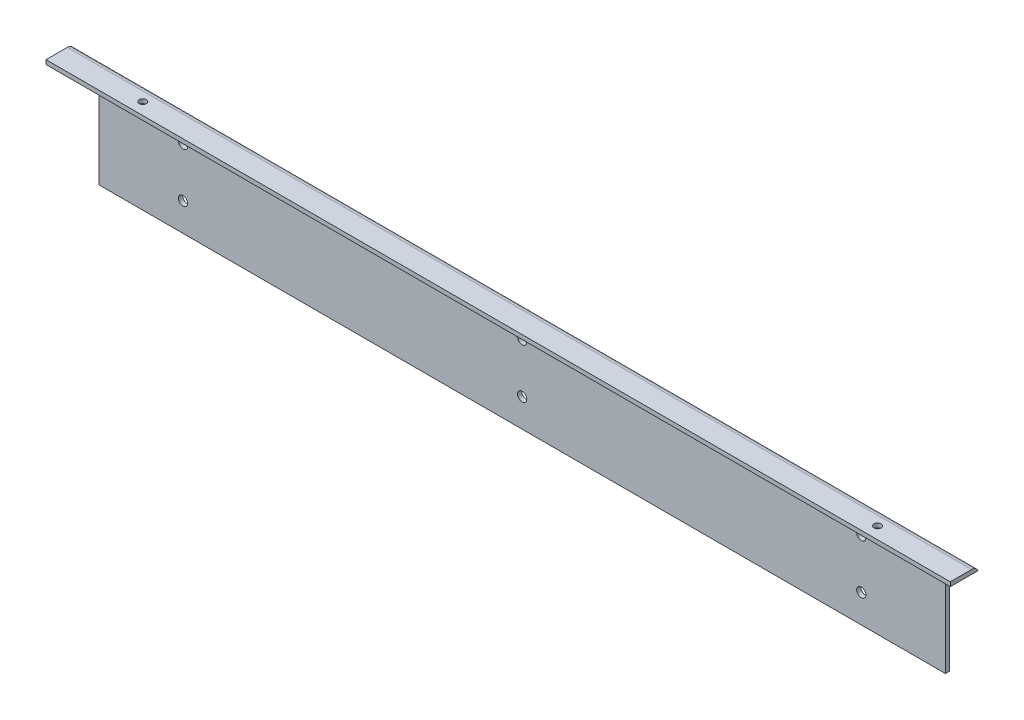
ISO-10303-21;
HEADER;
FILE_DESCRIPTION(('STEP AP214'),'2;1');
FILE_NAME('part.step','',(''),(''),'','','');
FILE_SCHEMA(('AUTOMOTIVE_DESIGN { 1 0 10303 214 1 1 1 1 }'));
ENDSEC;
DATA;
#1=APPLICATION_CONTEXT('core data for automotive mechanical design processes');
#2=APPLICATION_PROTOCOL_DEFINITION('international standard','automotive_design',2000,#1);
#3=PRODUCT_CONTEXT('',#1,'mechanical');
#4=PRODUCT('Part','Part','',(#3));
#5=PRODUCT_RELATED_PRODUCT_CATEGORY('part','',(#4));
#6=PRODUCT_DEFINITION_FORMATION('','',#4);
#7=PRODUCT_DEFINITION_CONTEXT('part definition',#1,'design');
#8=PRODUCT_DEFINITION('design','',#6,#7);
#9=PRODUCT_DEFINITION_SHAPE('','',#8);
#10=(LENGTH_UNIT() NAMED_UNIT(*) SI_UNIT(.MILLI.,.METRE.));
#11=(NAMED_UNIT(*) PLANE_ANGLE_UNIT() SI_UNIT($,.RADIAN.));
#12=(NAMED_UNIT(*) SI_UNIT($,.STERADIAN.) SOLID_ANGLE_UNIT());
#13=UNCERTAINTY_MEASURE_WITH_UNIT(LENGTH_MEASURE(1.E-05),#10,'distance_accuracy_value','');
#14=(GEOMETRIC_REPRESENTATION_CONTEXT(3) GLOBAL_UNCERTAINTY_ASSIGNED_CONTEXT((#13)) GLOBAL_UNIT_ASSIGNED_CONTEXT((#10,
#11,#12)) REPRESENTATION_CONTEXT('',''));
#15=CARTESIAN_POINT('',(0.,0.,0.));
#16=DIRECTION('',(0.,0.,1.));
#17=DIRECTION('',(1.,0.,0.));
#18=AXIS2_PLACEMENT_3D('',#15,#16,#17);
#19=CARTESIAN_POINT('',(0.,0.,3.));
#20=DIRECTION('',(0.,0.,-1.));
#21=DIRECTION('',(-1.,0.,0.));
#22=AXIS2_PLACEMENT_3D('',#19,#20,#21);
#23=PLANE('',#22);
#24=CARTESIAN_POINT('',(560.,55.,3.));
#25=DIRECTION('',(0.,0.,1.));
#26=DIRECTION('',(1.,0.,0.));
#27=AXIS2_PLACEMENT_3D('',#24,#25,#26);
#28=CIRCLE('',#27,3.24999999999995);
#29=CARTESIAN_POINT('',(563.25,55.,3.));
#30=VERTEX_POINT('',#29);
#31=EDGE_CURVE('E240',#30,#30,#28,.T.);
#32=ORIENTED_EDGE('',*,*,#31,.F.);
#33=EDGE_LOOP('',(#32));
#34=FACE_BOUND('',#33,.T.);
#35=CARTESIAN_POINT('',(320.,20.,3.));
#36=DIRECTION('',(0.,0.,1.));
#37=DIRECTION('',(1.,0.,0.));
#38=AXIS2_PLACEMENT_3D('',#35,#36,#37);
#39=CIRCLE('',#38,3.24999999999995);
#40=CARTESIAN_POINT('',(323.25,20.,3.));
#41=VERTEX_POINT('',#40);
#42=EDGE_CURVE('E231',#41,#41,#39,.T.);
#43=ORIENTED_EDGE('',*,*,#42,.F.);
#44=EDGE_LOOP('',(#43));
#45=FACE_BOUND('',#44,.T.);
#46=CARTESIAN_POINT('',(320.,55.,3.));
#47=DIRECTION('',(0.,0.,1.));
#48=DIRECTION('',(1.,0.,0.));
#49=AXIS2_PLACEMENT_3D('',#46,#47,#48);
#50=CIRCLE('',#49,3.24999999999995);
#51=CARTESIAN_POINT('',(323.25,55.,3.));
#52=VERTEX_POINT('',#51);
#53=EDGE_CURVE('E256',#52,#52,#50,.T.);
#54=ORIENTED_EDGE('',*,*,#53,.F.);
#55=EDGE_LOOP('',(#54));
#56=FACE_BOUND('',#55,.T.);
#57=CARTESIAN_POINT('',(80.,20.,3.));
#58=DIRECTION('',(0.,0.,1.));
#59=DIRECTION('',(1.,0.,0.));
#60=AXIS2_PLACEMENT_3D('',#57,#58,#59);
#61=CIRCLE('',#60,3.25000000000001);
#62=CARTESIAN_POINT('',(83.25,20.,3.));
#63=VERTEX_POINT('',#62);
#64=EDGE_CURVE('E247',#63,#63,#61,.T.);
#65=ORIENTED_EDGE('',*,*,#64,.F.);
#66=EDGE_LOOP('',(#65));
#67=FACE_BOUND('',#66,.T.);
#68=CARTESIAN_POINT('',(560.,20.,3.));
#69=DIRECTION('',(0.,0.,1.));
#70=DIRECTION('',(1.,0.,0.));
#71=AXIS2_PLACEMENT_3D('',#68,#69,#70);
#72=CIRCLE('',#71,3.24999999999995);
#73=CARTESIAN_POINT('',(563.25,20.,3.));
#74=VERTEX_POINT('',#73);
#75=EDGE_CURVE('E223',#74,#74,#72,.T.);
#76=ORIENTED_EDGE('',*,*,#75,.F.);
#77=EDGE_LOOP('',(#76));
#78=FACE_BOUND('',#77,.T.);
#79=CARTESIAN_POINT('',(80.,55.,3.));
#80=DIRECTION('',(0.,0.,1.));
#81=DIRECTION('',(1.,0.,0.));
#82=AXIS2_PLACEMENT_3D('',#79,#80,#81);
#83=CIRCLE('',#82,3.25000000000001);
#84=CARTESIAN_POINT('',(83.25,55.,3.));
#85=VERTEX_POINT('',#84);
#86=EDGE_CURVE('E251',#85,#85,#83,.T.);
#87=ORIENTED_EDGE('',*,*,#86,.F.);
#88=EDGE_LOOP('',(#87));
#89=FACE_BOUND('',#88,.T.);
#90=DIRECTION('',(0.,-1.,0.));
#91=VECTOR('',#90,1.);
#92=CARTESIAN_POINT('',(619.5,0.,3.));
#93=LINE('',#92,#91);
#94=CARTESIAN_POINT('',(619.5,70.,3.));
#95=VERTEX_POINT('',#94);
#96=CARTESIAN_POINT('',(619.5,0.,3.));
#97=VERTEX_POINT('',#96);
#98=EDGE_CURVE('E209',#95,#97,#93,.T.);
#99=ORIENTED_EDGE('',*,*,#98,.F.);
#100=DIRECTION('',(1.,0.,0.));
#101=VECTOR('',#100,1.);
#102=CARTESIAN_POINT('',(20.5000000000001,70.,3.));
#103=LINE('',#102,#101);
#104=CARTESIAN_POINT('',(20.5000000000001,70.,3.));
#105=VERTEX_POINT('',#104);
#106=EDGE_CURVE('E67',#95,#105,#103,.F.);
#107=ORIENTED_EDGE('',*,*,#106,.T.);
#108=DIRECTION('',(0.,1.,0.));
#109=VECTOR('',#108,1.);
#110=CARTESIAN_POINT('',(20.5000000000001,0.,3.));
#111=LINE('',#110,#109);
#112=CARTESIAN_POINT('',(20.5000000000001,0.,3.));
#113=VERTEX_POINT('',#112);
#114=EDGE_CURVE('E135',#113,#105,#111,.T.);
#115=ORIENTED_EDGE('',*,*,#114,.F.);
#116=DIRECTION('',(1.,0.,0.));
#117=VECTOR('',#116,1.);
#118=CARTESIAN_POINT('',(0.,0.,3.));
#119=LINE('',#118,#117);
#120=EDGE_CURVE('E144',#113,#97,#119,.T.);
#121=ORIENTED_EDGE('',*,*,#120,.T.);
#122=EDGE_LOOP('',(#99,#107,#115,#121));
#123=FACE_BOUND('',#122,.T.);
#124=ADVANCED_FACE('F45',(#34,#45,#56,#67,#78,#89,#123),#23,.F.);
#125=CARTESIAN_POINT('',(0.,0.,3.));
#126=DIRECTION('',(1.,0.,0.));
#127=DIRECTION('',(0.,0.,-1.));
#128=AXIS2_PLACEMENT_3D('',#125,#126,#127);
#129=PLANE('',#128);
#130=CARTESIAN_POINT('',(0.,70.,5.));
#131=DIRECTION('',(1.,0.,0.));
#132=DIRECTION('',(0.,0.,-1.));
#133=AXIS2_PLACEMENT_3D('',#130,#131,#132);
#134=CIRCLE('',#133,5.);
#135=CARTESIAN_POINT('',(0.,75.,5.));
#136=VERTEX_POINT('',#135);
#137=CARTESIAN_POINT('',(0.,72.,0.417424305044161));
#138=VERTEX_POINT('',#137);
#139=EDGE_CURVE('E173',#136,#138,#134,.F.);
#140=ORIENTED_EDGE('',*,*,#139,.T.);
#141=DIRECTION('',(0.,0.,-1.));
#142=VECTOR('',#141,1.);
#143=CARTESIAN_POINT('',(0.,72.,20.));
#144=LINE('',#143,#142);
#145=CARTESIAN_POINT('',(0.,72.,20.));
#146=VERTEX_POINT('',#145);
#147=EDGE_CURVE('E153',#146,#138,#144,.T.);
#148=ORIENTED_EDGE('',*,*,#147,.F.);
#149=DIRECTION('',(0.,-1.,0.));
#150=VECTOR('',#149,1.);
#151=CARTESIAN_POINT('',(0.,75.,20.));
#152=LINE('',#151,#150);
#153=CARTESIAN_POINT('',(0.,75.,20.));
#154=VERTEX_POINT('',#153);
#155=EDGE_CURVE('E275',#154,#146,#152,.T.);
#156=ORIENTED_EDGE('',*,*,#155,.F.);
#157=DIRECTION('',(0.,0.,-1.));
#158=VECTOR('',#157,1.);
#159=CARTESIAN_POINT('',(0.,75.,3.));
#160=LINE('',#159,#158);
#161=EDGE_CURVE('E157',#154,#136,#160,.T.);
#162=ORIENTED_EDGE('',*,*,#161,.T.);
#163=EDGE_LOOP('',(#140,#148,#156,#162));
#164=FACE_BOUND('',#163,.T.);
#165=ADVANCED_FACE('F318',(#164),#129,.F.);
#166=CARTESIAN_POINT('',(0.,0.,3.));
#167=DIRECTION('',(0.,1.,0.));
#168=DIRECTION('',(0.,0.,1.));
#169=AXIS2_PLACEMENT_3D('',#166,#167,#168);
#170=PLANE('',#169);
#171=ORIENTED_EDGE('',*,*,#120,.F.);
#172=DIRECTION('',(0.,0.,1.));
#173=VECTOR('',#172,1.);
#174=CARTESIAN_POINT('',(20.5000000000001,0.,0.));
#175=LINE('',#174,#173);
#176=CARTESIAN_POINT('',(20.5000000000001,0.,0.));
#177=VERTEX_POINT('',#176);
#178=EDGE_CURVE('E125',#177,#113,#175,.T.);
#179=ORIENTED_EDGE('',*,*,#178,.F.);
#180=DIRECTION('',(1.,0.,0.));
#181=VECTOR('',#180,1.);
#182=CARTESIAN_POINT('',(0.,0.,0.));
#183=LINE('',#182,#181);
#184=CARTESIAN_POINT('',(619.5,0.,0.));
#185=VERTEX_POINT('',#184);
#186=EDGE_CURVE('E142',#177,#185,#183,.T.);
#187=ORIENTED_EDGE('',*,*,#186,.T.);
#188=DIRECTION('',(0.,0.,1.));
#189=VECTOR('',#188,1.);
#190=CARTESIAN_POINT('',(619.5,0.,0.));
#191=LINE('',#190,#189);
#192=EDGE_CURVE('E218',#185,#97,#191,.T.);
#193=ORIENTED_EDGE('',*,*,#192,.T.);
#194=EDGE_LOOP('',(#171,#179,#187,#193));
#195=FACE_BOUND('',#194,.T.);
#196=ADVANCED_FACE('F140',(#195),#170,.F.);
#197=CARTESIAN_POINT('',(640.,0.,3.));
#198=DIRECTION('',(-1.,0.,0.));
#199=DIRECTION('',(0.,0.,1.));
#200=AXIS2_PLACEMENT_3D('',#197,#198,#199);
#201=PLANE('',#200);
#202=DIRECTION('',(0.,0.,-1.));
#203=VECTOR('',#202,1.);
#204=CARTESIAN_POINT('',(640.,72.,20.));
#205=LINE('',#204,#203);
#206=CARTESIAN_POINT('',(640.,72.,20.));
#207=VERTEX_POINT('',#206);
#208=CARTESIAN_POINT('',(640.,72.,0.417424305044161));
#209=VERTEX_POINT('',#208);
#210=EDGE_CURVE('E159',#207,#209,#205,.T.);
#211=ORIENTED_EDGE('',*,*,#210,.T.);
#212=CARTESIAN_POINT('',(640.,70.,5.));
#213=DIRECTION('',(-1.,0.,0.));
#214=DIRECTION('',(0.,0.,1.));
#215=AXIS2_PLACEMENT_3D('',#212,#213,#214);
#216=CIRCLE('',#215,5.);
#217=CARTESIAN_POINT('',(640.,75.,5.));
#218=VERTEX_POINT('',#217);
#219=EDGE_CURVE('E180',#209,#218,#216,.F.);
#220=ORIENTED_EDGE('',*,*,#219,.T.);
#221=DIRECTION('',(0.,0.,-1.));
#222=VECTOR('',#221,1.);
#223=CARTESIAN_POINT('',(640.,75.,3.));
#224=LINE('',#223,#222);
#225=CARTESIAN_POINT('',(640.,75.,20.));
#226=VERTEX_POINT('',#225);
#227=EDGE_CURVE('E165',#226,#218,#224,.T.);
#228=ORIENTED_EDGE('',*,*,#227,.F.);
#229=DIRECTION('',(0.,1.,0.));
#230=VECTOR('',#229,1.);
#231=CARTESIAN_POINT('',(640.,75.,20.));
#232=LINE('',#231,#230);
#233=EDGE_CURVE('E293',#207,#226,#232,.T.);
#234=ORIENTED_EDGE('',*,*,#233,.F.);
#235=EDGE_LOOP('',(#211,#220,#228,#234));
#236=FACE_BOUND('',#235,.T.);
#237=ADVANCED_FACE('F305',(#236),#201,.F.);
#238=CARTESIAN_POINT('',(0.,75.,3.));
#239=DIRECTION('',(0.,-1.,0.));
#240=DIRECTION('',(0.,0.,-1.));
#241=AXIS2_PLACEMENT_3D('',#238,#239,#240);
#242=PLANE('',#241);
#243=CARTESIAN_POINT('',(60.,75.,11.5));
#244=DIRECTION('',(0.,-1.,0.));
#245=DIRECTION('',(0.,0.,-1.));
#246=AXIS2_PLACEMENT_3D('',#243,#244,#245);
#247=CIRCLE('',#246,2.5);
#248=CARTESIAN_POINT('',(60.,75.,9.));
#249=VERTEX_POINT('',#248);
#250=EDGE_CURVE('E271',#249,#249,#247,.T.);
#251=ORIENTED_EDGE('',*,*,#250,.T.);
#252=EDGE_LOOP('',(#251));
#253=FACE_BOUND('',#252,.T.);
#254=CARTESIAN_POINT('',(580.,75.,11.5));
#255=DIRECTION('',(0.,-1.,0.));
#256=DIRECTION('',(0.,0.,-1.));
#257=AXIS2_PLACEMENT_3D('',#254,#255,#256);
#258=CIRCLE('',#257,2.49999999999991);
#259=CARTESIAN_POINT('',(580.,75.,9.00000000000009));
#260=VERTEX_POINT('',#259);
#261=EDGE_CURVE('E267',#260,#260,#258,.T.);
#262=ORIENTED_EDGE('',*,*,#261,.T.);
#263=EDGE_LOOP('',(#262));
#264=FACE_BOUND('',#263,.T.);
#265=ORIENTED_EDGE('',*,*,#227,.T.);
#266=DIRECTION('',(-1.,0.,0.));
#267=VECTOR('',#266,1.);
#268=CARTESIAN_POINT('',(0.,75.,5.));
#269=LINE('',#268,#267);
#270=EDGE_CURVE('E169',#218,#136,#269,.T.);
#271=ORIENTED_EDGE('',*,*,#270,.T.);
#272=ORIENTED_EDGE('',*,*,#161,.F.);
#273=DIRECTION('',(-1.,0.,0.));
#274=VECTOR('',#273,1.);
#275=CARTESIAN_POINT('',(0.,75.,20.));
#276=LINE('',#275,#274);
#277=EDGE_CURVE('E297',#226,#154,#276,.T.);
#278=ORIENTED_EDGE('',*,*,#277,.F.);
#279=EDGE_LOOP('',(#265,#271,#272,#278));
#280=FACE_BOUND('',#279,.T.);
#281=ADVANCED_FACE('F314',(#253,#264,#280),#242,.F.);
#282=CARTESIAN_POINT('',(0.,0.,0.));
#283=DIRECTION('',(0.,0.,-1.));
#284=DIRECTION('',(-1.,0.,0.));
#285=AXIS2_PLACEMENT_3D('',#282,#283,#284);
#286=PLANE('',#285);
#287=DIRECTION('',(0.,1.,0.));
#288=VECTOR('',#287,1.);
#289=CARTESIAN_POINT('',(20.5000000000001,0.,0.));
#290=LINE('',#289,#288);
#291=CARTESIAN_POINT('',(20.5000000000001,70.,0.));
#292=VERTEX_POINT('',#291);
#293=EDGE_CURVE('E122',#177,#292,#290,.T.);
#294=ORIENTED_EDGE('',*,*,#293,.T.);
#295=DIRECTION('',(-1.,0.,0.));
#296=VECTOR('',#295,1.);
#297=CARTESIAN_POINT('',(640.,70.,0.));
#298=LINE('',#297,#296);
#299=CARTESIAN_POINT('',(619.5,70.,0.));
#300=VERTEX_POINT('',#299);
#301=EDGE_CURVE('E177',#292,#300,#298,.F.);
#302=ORIENTED_EDGE('',*,*,#301,.T.);
#303=DIRECTION('',(0.,-1.,0.));
#304=VECTOR('',#303,1.);
#305=CARTESIAN_POINT('',(619.5,0.,0.));
#306=LINE('',#305,#304);
#307=EDGE_CURVE('E151',#300,#185,#306,.T.);
#308=ORIENTED_EDGE('',*,*,#307,.T.);
#309=ORIENTED_EDGE('',*,*,#186,.F.);
#310=EDGE_LOOP('',(#294,#302,#308,#309));
#311=FACE_BOUND('',#310,.T.);
#312=CARTESIAN_POINT('',(560.,55.,0.));
#313=DIRECTION('',(0.,0.,1.));
#314=DIRECTION('',(1.,0.,0.));
#315=AXIS2_PLACEMENT_3D('',#312,#313,#314);
#316=CIRCLE('',#315,3.24999999999995);
#317=CARTESIAN_POINT('',(563.25,55.,0.));
#318=VERTEX_POINT('',#317);
#319=EDGE_CURVE('E227',#318,#318,#316,.T.);
#320=ORIENTED_EDGE('',*,*,#319,.T.);
#321=EDGE_LOOP('',(#320));
#322=FACE_BOUND('',#321,.T.);
#323=CARTESIAN_POINT('',(320.,20.,0.));
#324=DIRECTION('',(0.,0.,1.));
#325=DIRECTION('',(1.,0.,0.));
#326=AXIS2_PLACEMENT_3D('',#323,#324,#325);
#327=CIRCLE('',#326,3.24999999999995);
#328=CARTESIAN_POINT('',(323.25,20.,0.));
#329=VERTEX_POINT('',#328);
#330=EDGE_CURVE('E236',#329,#329,#327,.T.);
#331=ORIENTED_EDGE('',*,*,#330,.T.);
#332=EDGE_LOOP('',(#331));
#333=FACE_BOUND('',#332,.T.);
#334=CARTESIAN_POINT('',(320.,55.,0.));
#335=DIRECTION('',(0.,0.,1.));
#336=DIRECTION('',(1.,0.,0.));
#337=AXIS2_PLACEMENT_3D('',#334,#335,#336);
#338=CIRCLE('',#337,3.24999999999995);
#339=CARTESIAN_POINT('',(323.25,55.,0.));
#340=VERTEX_POINT('',#339);
#341=EDGE_CURVE('E235',#340,#340,#338,.T.);
#342=ORIENTED_EDGE('',*,*,#341,.T.);
#343=EDGE_LOOP('',(#342));
#344=FACE_BOUND('',#343,.T.);
#345=CARTESIAN_POINT('',(80.,20.,0.));
#346=DIRECTION('',(0.,0.,1.));
#347=DIRECTION('',(1.,0.,0.));
#348=AXIS2_PLACEMENT_3D('',#345,#346,#347);
#349=CIRCLE('',#348,3.25000000000001);
#350=CARTESIAN_POINT('',(83.25,20.,0.));
#351=VERTEX_POINT('',#350);
#352=EDGE_CURVE('E252',#351,#351,#349,.T.);
#353=ORIENTED_EDGE('',*,*,#352,.T.);
#354=EDGE_LOOP('',(#353));
#355=FACE_BOUND('',#354,.T.);
#356=CARTESIAN_POINT('',(560.,20.,0.));
#357=DIRECTION('',(0.,0.,1.));
#358=DIRECTION('',(1.,0.,0.));
#359=AXIS2_PLACEMENT_3D('',#356,#357,#358);
#360=CIRCLE('',#359,3.24999999999995);
#361=CARTESIAN_POINT('',(563.25,20.,0.));
#362=VERTEX_POINT('',#361);
#363=EDGE_CURVE('E146',#362,#362,#360,.T.);
#364=ORIENTED_EDGE('',*,*,#363,.T.);
#365=EDGE_LOOP('',(#364));
#366=FACE_BOUND('',#365,.T.);
#367=CARTESIAN_POINT('',(80.,55.,0.));
#368=DIRECTION('',(0.,0.,1.));
#369=DIRECTION('',(1.,0.,0.));
#370=AXIS2_PLACEMENT_3D('',#367,#368,#369);
#371=CIRCLE('',#370,3.25000000000001);
#372=CARTESIAN_POINT('',(83.25,55.,0.));
#373=VERTEX_POINT('',#372);
#374=EDGE_CURVE('E263',#373,#373,#371,.T.);
#375=ORIENTED_EDGE('',*,*,#374,.T.);
#376=EDGE_LOOP('',(#375));
#377=FACE_BOUND('',#376,.T.);
#378=ADVANCED_FACE('F149',(#311,#322,#333,#344,#355,#366,#377),#286,.T.);
#379=CARTESIAN_POINT('',(0.,72.,20.));
#380=DIRECTION('',(0.,1.,0.));
#381=DIRECTION('',(0.,0.,1.));
#382=AXIS2_PLACEMENT_3D('',#379,#380,#381);
#383=PLANE('',#382);
#384=CARTESIAN_POINT('',(60.,72.,11.5));
#385=DIRECTION('',(0.,-1.,0.));
#386=DIRECTION('',(0.,0.,-1.));
#387=AXIS2_PLACEMENT_3D('',#384,#385,#386);
#388=CIRCLE('',#387,2.5);
#389=CARTESIAN_POINT('',(60.,72.,9.));
#390=VERTEX_POINT('',#389);
#391=EDGE_CURVE('E276',#390,#390,#388,.T.);
#392=ORIENTED_EDGE('',*,*,#391,.F.);
#393=EDGE_LOOP('',(#392));
#394=FACE_BOUND('',#393,.T.);
#395=CARTESIAN_POINT('',(580.,72.,11.5));
#396=DIRECTION('',(0.,-1.,0.));
#397=DIRECTION('',(0.,0.,-1.));
#398=AXIS2_PLACEMENT_3D('',#395,#396,#397);
#399=CIRCLE('',#398,2.49999999999991);
#400=CARTESIAN_POINT('',(580.,72.,9.00000000000009));
#401=VERTEX_POINT('',#400);
#402=EDGE_CURVE('E280',#401,#401,#399,.T.);
#403=ORIENTED_EDGE('',*,*,#402,.F.);
#404=EDGE_LOOP('',(#403));
#405=FACE_BOUND('',#404,.T.);
#406=DIRECTION('',(1.,0.,0.));
#407=VECTOR('',#406,1.);
#408=CARTESIAN_POINT('',(619.5,72.,5.));
#409=LINE('',#408,#407);
#410=CARTESIAN_POINT('',(20.5000000000001,72.,5.));
#411=VERTEX_POINT('',#410);
#412=CARTESIAN_POINT('',(619.5,72.,5.));
#413=VERTEX_POINT('',#412);
#414=EDGE_CURVE('E196',#411,#413,#409,.T.);
#415=ORIENTED_EDGE('',*,*,#414,.T.);
#416=DIRECTION('',(0.,0.,1.));
#417=VECTOR('',#416,1.);
#418=CARTESIAN_POINT('',(619.5,72.,0.));
#419=LINE('',#418,#417);
#420=CARTESIAN_POINT('',(619.5,72.,0.417424305044161));
#421=VERTEX_POINT('',#420);
#422=EDGE_CURVE('E205',#421,#413,#419,.T.);
#423=ORIENTED_EDGE('',*,*,#422,.F.);
#424=DIRECTION('',(1.,0.,0.));
#425=VECTOR('',#424,1.);
#426=CARTESIAN_POINT('',(0.,72.,0.417424305044161));
#427=LINE('',#426,#425);
#428=EDGE_CURVE('E183',#421,#209,#427,.T.);
#429=ORIENTED_EDGE('',*,*,#428,.T.);
#430=ORIENTED_EDGE('',*,*,#210,.F.);
#431=DIRECTION('',(1.,0.,0.));
#432=VECTOR('',#431,1.);
#433=CARTESIAN_POINT('',(0.,72.,20.));
#434=LINE('',#433,#432);
#435=EDGE_CURVE('E290',#146,#207,#434,.T.);
#436=ORIENTED_EDGE('',*,*,#435,.F.);
#437=ORIENTED_EDGE('',*,*,#147,.T.);
#438=DIRECTION('',(1.,0.,0.));
#439=VECTOR('',#438,1.);
#440=CARTESIAN_POINT('',(0.,72.,0.417424305044161));
#441=LINE('',#440,#439);
#442=CARTESIAN_POINT('',(20.5000000000001,72.,0.417424305044161));
#443=VERTEX_POINT('',#442);
#444=EDGE_CURVE('E191',#138,#443,#441,.T.);
#445=ORIENTED_EDGE('',*,*,#444,.T.);
#446=DIRECTION('',(0.,0.,1.));
#447=VECTOR('',#446,1.);
#448=CARTESIAN_POINT('',(20.5000000000001,72.,0.));
#449=LINE('',#448,#447);
#450=EDGE_CURVE('E134',#443,#411,#449,.T.);
#451=ORIENTED_EDGE('',*,*,#450,.T.);
#452=EDGE_LOOP('',(#415,#423,#429,#430,#436,#437,#445,#451));
#453=FACE_BOUND('',#452,.T.);
#454=ADVANCED_FACE('F204',(#394,#405,#453),#383,.F.);
#455=CARTESIAN_POINT('',(0.,0.,20.));
#456=DIRECTION('',(0.,0.,1.));
#457=DIRECTION('',(1.,0.,0.));
#458=AXIS2_PLACEMENT_3D('',#455,#456,#457);
#459=PLANE('',#458);
#460=ORIENTED_EDGE('',*,*,#155,.T.);
#461=ORIENTED_EDGE('',*,*,#435,.T.);
#462=ORIENTED_EDGE('',*,*,#233,.T.);
#463=ORIENTED_EDGE('',*,*,#277,.T.);
#464=EDGE_LOOP('',(#460,#461,#462,#463));
#465=FACE_BOUND('',#464,.T.);
#466=ADVANCED_FACE('F321',(#465),#459,.T.);
#467=CARTESIAN_POINT('',(0.,70.,5.));
#468=DIRECTION('',(1.,0.,0.));
#469=DIRECTION('',(0.,0.,-1.));
#470=AXIS2_PLACEMENT_3D('',#467,#468,#469);
#471=CYLINDRICAL_SURFACE('',#470,5.);
#472=CARTESIAN_POINT('',(20.5000000000001,70.,5.));
#473=DIRECTION('',(1.,0.,0.));
#474=DIRECTION('',(0.,0.,-1.));
#475=AXIS2_PLACEMENT_3D('',#472,#473,#474);
#476=CIRCLE('',#475,5.);
#477=EDGE_CURVE('E128',#443,#292,#476,.F.);
#478=ORIENTED_EDGE('',*,*,#477,.F.);
#479=ORIENTED_EDGE('',*,*,#444,.F.);
#480=ORIENTED_EDGE('',*,*,#139,.F.);
#481=ORIENTED_EDGE('',*,*,#270,.F.);
#482=ORIENTED_EDGE('',*,*,#219,.F.);
#483=ORIENTED_EDGE('',*,*,#428,.F.);
#484=CARTESIAN_POINT('',(619.5,70.,5.));
#485=DIRECTION('',(-1.,0.,0.));
#486=DIRECTION('',(0.,0.,1.));
#487=AXIS2_PLACEMENT_3D('',#484,#485,#486);
#488=CIRCLE('',#487,5.);
#489=EDGE_CURVE('E187',#300,#421,#488,.F.);
#490=ORIENTED_EDGE('',*,*,#489,.F.);
#491=ORIENTED_EDGE('',*,*,#301,.F.);
#492=EDGE_LOOP('',(#478,#479,#480,#481,#482,#483,#490,#491));
#493=FACE_BOUND('',#492,.T.);
#494=ADVANCED_FACE('F311',(#493),#471,.T.);
#495=CARTESIAN_POINT('',(580.,75.,11.5));
#496=DIRECTION('',(0.,-1.,0.));
#497=DIRECTION('',(0.,0.,-1.));
#498=AXIS2_PLACEMENT_3D('',#495,#496,#497);
#499=CYLINDRICAL_SURFACE('',#498,2.49999999999991);
#500=ORIENTED_EDGE('',*,*,#261,.F.);
#501=EDGE_LOOP('',(#500));
#502=FACE_BOUND('',#501,.T.);
#503=ORIENTED_EDGE('',*,*,#402,.T.);
#504=EDGE_LOOP('',(#503));
#505=FACE_BOUND('',#504,.T.);
#506=ADVANCED_FACE('F345',(#502,#505),#499,.F.);
#507=CARTESIAN_POINT('',(60.,75.,11.5));
#508=DIRECTION('',(0.,-1.,0.));
#509=DIRECTION('',(0.,0.,-1.));
#510=AXIS2_PLACEMENT_3D('',#507,#508,#509);
#511=CYLINDRICAL_SURFACE('',#510,2.5);
#512=ORIENTED_EDGE('',*,*,#250,.F.);
#513=EDGE_LOOP('',(#512));
#514=FACE_BOUND('',#513,.T.);
#515=ORIENTED_EDGE('',*,*,#391,.T.);
#516=EDGE_LOOP('',(#515));
#517=FACE_BOUND('',#516,.T.);
#518=ADVANCED_FACE('F349',(#514,#517),#511,.F.);
#519=CARTESIAN_POINT('',(80.,55.,0.));
#520=DIRECTION('',(0.,0.,1.));
#521=DIRECTION('',(1.,0.,0.));
#522=AXIS2_PLACEMENT_3D('',#519,#520,#521);
#523=CYLINDRICAL_SURFACE('',#522,3.25000000000001);
#524=ORIENTED_EDGE('',*,*,#374,.F.);
#525=EDGE_LOOP('',(#524));
#526=FACE_BOUND('',#525,.T.);
#527=ORIENTED_EDGE('',*,*,#86,.T.);
#528=EDGE_LOOP('',(#527));
#529=FACE_BOUND('',#528,.T.);
#530=ADVANCED_FACE('F359',(#526,#529),#523,.F.);
#531=CARTESIAN_POINT('',(560.,20.,0.));
#532=DIRECTION('',(0.,0.,1.));
#533=DIRECTION('',(1.,0.,0.));
#534=AXIS2_PLACEMENT_3D('',#531,#532,#533);
#535=CYLINDRICAL_SURFACE('',#534,3.24999999999995);
#536=ORIENTED_EDGE('',*,*,#363,.F.);
#537=EDGE_LOOP('',(#536));
#538=FACE_BOUND('',#537,.T.);
#539=ORIENTED_EDGE('',*,*,#75,.T.);
#540=EDGE_LOOP('',(#539));
#541=FACE_BOUND('',#540,.T.);
#542=ADVANCED_FACE('F363',(#538,#541),#535,.F.);
#543=CARTESIAN_POINT('',(80.,20.,0.));
#544=DIRECTION('',(0.,0.,1.));
#545=DIRECTION('',(1.,0.,0.));
#546=AXIS2_PLACEMENT_3D('',#543,#544,#545);
#547=CYLINDRICAL_SURFACE('',#546,3.25000000000001);
#548=ORIENTED_EDGE('',*,*,#352,.F.);
#549=EDGE_LOOP('',(#548));
#550=FACE_BOUND('',#549,.T.);
#551=ORIENTED_EDGE('',*,*,#64,.T.);
#552=EDGE_LOOP('',(#551));
#553=FACE_BOUND('',#552,.T.);
#554=ADVANCED_FACE('F369',(#550,#553),#547,.F.);
#555=CARTESIAN_POINT('',(320.,55.,0.));
#556=DIRECTION('',(0.,0.,1.));
#557=DIRECTION('',(1.,0.,0.));
#558=AXIS2_PLACEMENT_3D('',#555,#556,#557);
#559=CYLINDRICAL_SURFACE('',#558,3.24999999999995);
#560=ORIENTED_EDGE('',*,*,#341,.F.);
#561=EDGE_LOOP('',(#560));
#562=FACE_BOUND('',#561,.T.);
#563=ORIENTED_EDGE('',*,*,#53,.T.);
#564=EDGE_LOOP('',(#563));
#565=FACE_BOUND('',#564,.T.);
#566=ADVANCED_FACE('F365',(#562,#565),#559,.F.);
#567=CARTESIAN_POINT('',(320.,20.,0.));
#568=DIRECTION('',(0.,0.,1.));
#569=DIRECTION('',(1.,0.,0.));
#570=AXIS2_PLACEMENT_3D('',#567,#568,#569);
#571=CYLINDRICAL_SURFACE('',#570,3.24999999999995);
#572=ORIENTED_EDGE('',*,*,#330,.F.);
#573=EDGE_LOOP('',(#572));
#574=FACE_BOUND('',#573,.T.);
#575=ORIENTED_EDGE('',*,*,#42,.T.);
#576=EDGE_LOOP('',(#575));
#577=FACE_BOUND('',#576,.T.);
#578=ADVANCED_FACE('F368',(#574,#577),#571,.F.);
#579=CARTESIAN_POINT('',(560.,55.,0.));
#580=DIRECTION('',(0.,0.,1.));
#581=DIRECTION('',(1.,0.,0.));
#582=AXIS2_PLACEMENT_3D('',#579,#580,#581);
#583=CYLINDRICAL_SURFACE('',#582,3.24999999999995);
#584=ORIENTED_EDGE('',*,*,#319,.F.);
#585=EDGE_LOOP('',(#584));
#586=FACE_BOUND('',#585,.T.);
#587=ORIENTED_EDGE('',*,*,#31,.T.);
#588=EDGE_LOOP('',(#587));
#589=FACE_BOUND('',#588,.T.);
#590=ADVANCED_FACE('F374',(#586,#589),#583,.F.);
#591=CARTESIAN_POINT('',(619.5,0.,0.));
#592=DIRECTION('',(-1.,0.,0.));
#593=DIRECTION('',(0.,0.,1.));
#594=AXIS2_PLACEMENT_3D('',#591,#592,#593);
#595=PLANE('',#594);
#596=ORIENTED_EDGE('',*,*,#489,.T.);
#597=ORIENTED_EDGE('',*,*,#422,.T.);
#598=CARTESIAN_POINT('',(619.5,70.,5.));
#599=DIRECTION('',(-1.,0.,0.));
#600=DIRECTION('',(0.,0.,1.));
#601=AXIS2_PLACEMENT_3D('',#598,#599,#600);
#602=CIRCLE('',#601,2.);
#603=EDGE_CURVE('E54',#413,#95,#602,.T.);
#604=ORIENTED_EDGE('',*,*,#603,.T.);
#605=ORIENTED_EDGE('',*,*,#98,.T.);
#606=ORIENTED_EDGE('',*,*,#192,.F.);
#607=ORIENTED_EDGE('',*,*,#307,.F.);
#608=EDGE_LOOP('',(#596,#597,#604,#605,#606,#607));
#609=FACE_BOUND('',#608,.T.);
#610=ADVANCED_FACE('F322',(#609),#595,.F.);
#611=CARTESIAN_POINT('',(20.5000000000001,0.,0.));
#612=DIRECTION('',(1.,0.,0.));
#613=DIRECTION('',(0.,0.,-1.));
#614=AXIS2_PLACEMENT_3D('',#611,#612,#613);
#615=PLANE('',#614);
#616=ORIENTED_EDGE('',*,*,#477,.T.);
#617=ORIENTED_EDGE('',*,*,#293,.F.);
#618=ORIENTED_EDGE('',*,*,#178,.T.);
#619=ORIENTED_EDGE('',*,*,#114,.T.);
#620=CARTESIAN_POINT('',(20.5000000000001,70.,5.));
#621=DIRECTION('',(1.,0.,0.));
#622=DIRECTION('',(0.,0.,-1.));
#623=AXIS2_PLACEMENT_3D('',#620,#621,#622);
#624=CIRCLE('',#623,2.);
#625=EDGE_CURVE('E11',#105,#411,#624,.T.);
#626=ORIENTED_EDGE('',*,*,#625,.T.);
#627=ORIENTED_EDGE('',*,*,#450,.F.);
#628=EDGE_LOOP('',(#616,#617,#618,#619,#626,#627));
#629=FACE_BOUND('',#628,.T.);
#630=ADVANCED_FACE('F124',(#629),#615,.F.);
#631=CARTESIAN_POINT('',(0.,70.,5.));
#632=DIRECTION('',(-1.,0.,0.));
#633=DIRECTION('',(0.,0.,1.));
#634=AXIS2_PLACEMENT_3D('',#631,#632,#633);
#635=CYLINDRICAL_SURFACE('',#634,2.);
#636=ORIENTED_EDGE('',*,*,#625,.F.);
#637=ORIENTED_EDGE('',*,*,#106,.F.);
#638=ORIENTED_EDGE('',*,*,#603,.F.);
#639=ORIENTED_EDGE('',*,*,#414,.F.);
#640=EDGE_LOOP('',(#636,#637,#638,#639));
#641=FACE_BOUND('',#640,.T.);
#642=ADVANCED_FACE('F47',(#641),#635,.F.);
#643=CLOSED_SHELL('',(#124,#165,#196,#237,#281,#378,#454,#466,#494,#506,#518,#530,#542,#554,
#566,#578,#590,#610,#630,#642));
#644=MANIFOLD_SOLID_BREP('B2',#643);
#645=ADVANCED_BREP_SHAPE_REPRESENTATION('',(#18,#644),#14);
#646=SHAPE_DEFINITION_REPRESENTATION(#9,#645);
ENDSEC;
END-ISO-10303-21;
